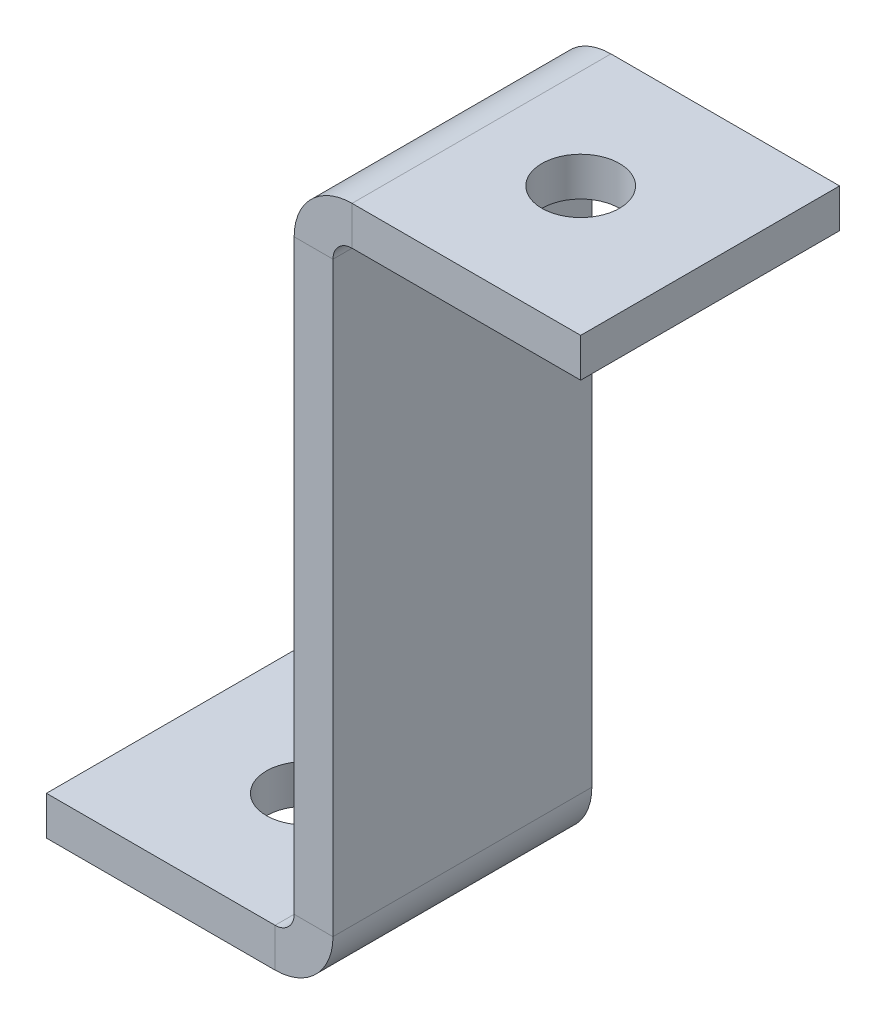
ISO-10303-21;
HEADER;
FILE_DESCRIPTION(('STEP AP214'),'2;1');
FILE_NAME('part.step','',(''),(''),'','','');
FILE_SCHEMA(('AUTOMOTIVE_DESIGN { 1 0 10303 214 1 1 1 1 }'));
ENDSEC;
DATA;
#1=APPLICATION_CONTEXT('core data for automotive mechanical design processes');
#2=APPLICATION_PROTOCOL_DEFINITION('international standard','automotive_design',2000,#1);
#3=PRODUCT_CONTEXT('',#1,'mechanical');
#4=PRODUCT('Part','Part','',(#3));
#5=PRODUCT_RELATED_PRODUCT_CATEGORY('part','',(#4));
#6=PRODUCT_DEFINITION_FORMATION('','',#4);
#7=PRODUCT_DEFINITION_CONTEXT('part definition',#1,'design');
#8=PRODUCT_DEFINITION('design','',#6,#7);
#9=PRODUCT_DEFINITION_SHAPE('','',#8);
#10=(LENGTH_UNIT() NAMED_UNIT(*) SI_UNIT(.MILLI.,.METRE.));
#11=(NAMED_UNIT(*) PLANE_ANGLE_UNIT() SI_UNIT($,.RADIAN.));
#12=(NAMED_UNIT(*) SI_UNIT($,.STERADIAN.) SOLID_ANGLE_UNIT());
#13=UNCERTAINTY_MEASURE_WITH_UNIT(LENGTH_MEASURE(1.E-05),#10,'distance_accuracy_value','');
#14=(GEOMETRIC_REPRESENTATION_CONTEXT(3) GLOBAL_UNCERTAINTY_ASSIGNED_CONTEXT((#13)) GLOBAL_UNIT_ASSIGNED_CONTEXT((#10,
#11,#12)) REPRESENTATION_CONTEXT('',''));
#15=CARTESIAN_POINT('',(0.,0.,0.));
#16=DIRECTION('',(0.,0.,1.));
#17=DIRECTION('',(1.,0.,0.));
#18=AXIS2_PLACEMENT_3D('',#15,#16,#17);
#19=CARTESIAN_POINT('',(11.0690270902934,-10.4309729097066,-10.));
#20=DIRECTION('',(0.,0.,-1.));
#21=DIRECTION('',(0.,-1.,0.));
#22=AXIS2_PLACEMENT_3D('',#19,#20,#21);
#23=PLANE('',#22);
#24=DIRECTION('',(0.,-1.,0.));
#25=VECTOR('',#24,1.);
#26=CARTESIAN_POINT('',(9.56902709029339,-10.4309729097066,-10.));
#27=LINE('',#26,#25);
#28=CARTESIAN_POINT('',(9.56902709029327,23.4014541805866,-10.));
#29=VERTEX_POINT('',#28);
#30=CARTESIAN_POINT('',(9.56902709029335,0.736600000000002,-10.));
#31=VERTEX_POINT('',#30);
#32=EDGE_CURVE('E71',#29,#31,#27,.T.);
#33=ORIENTED_EDGE('',*,*,#32,.F.);
#34=DIRECTION('',(1.,0.,0.));
#35=VECTOR('',#34,1.);
#36=CARTESIAN_POINT('',(11.0690270902933,23.4014541805867,-10.));
#37=LINE('',#36,#35);
#38=CARTESIAN_POINT('',(11.0690270902933,23.4014541805867,-10.));
#39=VERTEX_POINT('',#38);
#40=EDGE_CURVE('E242',#29,#39,#37,.T.);
#41=ORIENTED_EDGE('',*,*,#40,.T.);
#42=DIRECTION('',(0.,-1.,0.));
#43=VECTOR('',#42,1.);
#44=CARTESIAN_POINT('',(11.0690270902934,-10.4309729097066,-10.));
#45=LINE('',#44,#43);
#46=CARTESIAN_POINT('',(11.0690270902933,0.736600000000007,-10.));
#47=VERTEX_POINT('',#46);
#48=EDGE_CURVE('E50',#39,#47,#45,.T.);
#49=ORIENTED_EDGE('',*,*,#48,.T.);
#50=DIRECTION('',(1.,0.,0.));
#51=VECTOR('',#50,1.);
#52=CARTESIAN_POINT('',(11.0690270902933,0.736600000000011,-10.));
#53=LINE('',#52,#51);
#54=EDGE_CURVE('E236',#31,#47,#53,.T.);
#55=ORIENTED_EDGE('',*,*,#54,.F.);
#56=EDGE_LOOP('',(#33,#41,#49,#55));
#57=FACE_BOUND('',#56,.T.);
#58=ADVANCED_FACE('F46',(#57),#23,.T.);
#59=CARTESIAN_POINT('',(11.0690270902934,-10.4309729097066,0.));
#60=DIRECTION('',(0.,0.,1.));
#61=DIRECTION('',(0.,1.,0.));
#62=AXIS2_PLACEMENT_3D('',#59,#60,#61);
#63=PLANE('',#62);
#64=DIRECTION('',(0.,1.,0.));
#65=VECTOR('',#64,1.);
#66=CARTESIAN_POINT('',(11.0690270902934,-10.4309729097066,0.));
#67=LINE('',#66,#65);
#68=CARTESIAN_POINT('',(11.0690270902934,0.736600000000007,0.));
#69=VERTEX_POINT('',#68);
#70=CARTESIAN_POINT('',(11.0690270902933,23.4014541805867,0.));
#71=VERTEX_POINT('',#70);
#72=EDGE_CURVE('E246',#69,#71,#67,.T.);
#73=ORIENTED_EDGE('',*,*,#72,.T.);
#74=DIRECTION('',(-1.,0.,0.));
#75=VECTOR('',#74,1.);
#76=CARTESIAN_POINT('',(11.0690270902933,23.4014541805867,0.));
#77=LINE('',#76,#75);
#78=CARTESIAN_POINT('',(9.56902709029327,23.4014541805867,0.));
#79=VERTEX_POINT('',#78);
#80=EDGE_CURVE('E12',#71,#79,#77,.T.);
#81=ORIENTED_EDGE('',*,*,#80,.T.);
#82=DIRECTION('',(0.,1.,0.));
#83=VECTOR('',#82,1.);
#84=CARTESIAN_POINT('',(9.56902709029339,-10.4309729097066,0.));
#85=LINE('',#84,#83);
#86=CARTESIAN_POINT('',(9.56902709029335,0.736600000000002,0.));
#87=VERTEX_POINT('',#86);
#88=EDGE_CURVE('E198',#87,#79,#85,.T.);
#89=ORIENTED_EDGE('',*,*,#88,.F.);
#90=DIRECTION('',(-1.,0.,0.));
#91=VECTOR('',#90,1.);
#92=CARTESIAN_POINT('',(11.0690270902933,0.736600000000011,0.));
#93=LINE('',#92,#91);
#94=EDGE_CURVE('E231',#69,#87,#93,.T.);
#95=ORIENTED_EDGE('',*,*,#94,.F.);
#96=EDGE_LOOP('',(#73,#81,#89,#95));
#97=FACE_BOUND('',#96,.T.);
#98=ADVANCED_FACE('F48',(#97),#63,.T.);
#99=CARTESIAN_POINT('',(11.0690270902934,-10.4309729097066,0.));
#100=DIRECTION('',(1.,0.,0.));
#101=DIRECTION('',(0.,0.,-1.));
#102=AXIS2_PLACEMENT_3D('',#99,#100,#101);
#103=PLANE('',#102);
#104=ORIENTED_EDGE('',*,*,#48,.F.);
#105=DIRECTION('',(0.,0.,1.));
#106=VECTOR('',#105,1.);
#107=CARTESIAN_POINT('',(11.0690270902933,23.4014541805867,0.));
#108=LINE('',#107,#106);
#109=EDGE_CURVE('E239',#39,#71,#108,.T.);
#110=ORIENTED_EDGE('',*,*,#109,.T.);
#111=ORIENTED_EDGE('',*,*,#72,.F.);
#112=DIRECTION('',(0.,0.,1.));
#113=VECTOR('',#112,1.);
#114=CARTESIAN_POINT('',(11.0690270902933,0.736600000000011,0.));
#115=LINE('',#114,#113);
#116=EDGE_CURVE('E228',#47,#69,#115,.T.);
#117=ORIENTED_EDGE('',*,*,#116,.F.);
#118=EDGE_LOOP('',(#104,#110,#111,#117));
#119=FACE_BOUND('',#118,.T.);
#120=ADVANCED_FACE('F261',(#119),#103,.T.);
#121=CARTESIAN_POINT('',(9.56902709029339,-10.4309729097066,0.));
#122=DIRECTION('',(1.,0.,0.));
#123=DIRECTION('',(0.,0.,-1.));
#124=AXIS2_PLACEMENT_3D('',#121,#122,#123);
#125=PLANE('',#124);
#126=DIRECTION('',(0.,0.,1.));
#127=VECTOR('',#126,1.);
#128=CARTESIAN_POINT('',(9.56902709029327,23.4014541805867,0.));
#129=LINE('',#128,#127);
#130=EDGE_CURVE('E55',#29,#79,#129,.T.);
#131=ORIENTED_EDGE('',*,*,#130,.F.);
#132=ORIENTED_EDGE('',*,*,#32,.T.);
#133=DIRECTION('',(0.,0.,1.));
#134=VECTOR('',#133,1.);
#135=CARTESIAN_POINT('',(9.56902709029335,0.736600000000006,0.));
#136=LINE('',#135,#134);
#137=EDGE_CURVE('E234',#31,#87,#136,.T.);
#138=ORIENTED_EDGE('',*,*,#137,.T.);
#139=ORIENTED_EDGE('',*,*,#88,.T.);
#140=EDGE_LOOP('',(#131,#132,#138,#139));
#141=FACE_BOUND('',#140,.T.);
#142=ADVANCED_FACE('F250',(#141),#125,.F.);
#143=CARTESIAN_POINT('',(0.,-1.5,0.));
#144=DIRECTION('',(-1.,0.,0.));
#145=DIRECTION('',(0.,0.,1.));
#146=AXIS2_PLACEMENT_3D('',#143,#144,#145);
#147=PLANE('',#146);
#148=DIRECTION('',(0.,0.,1.));
#149=VECTOR('',#148,1.);
#150=CARTESIAN_POINT('',(0.,0.,0.));
#151=LINE('',#150,#149);
#152=CARTESIAN_POINT('',(0.,0.,-10.));
#153=VERTEX_POINT('',#152);
#154=CARTESIAN_POINT('',(0.,0.,0.));
#155=VERTEX_POINT('',#154);
#156=EDGE_CURVE('E207',#153,#155,#151,.T.);
#157=ORIENTED_EDGE('',*,*,#156,.F.);
#158=DIRECTION('',(0.,1.,0.));
#159=VECTOR('',#158,1.);
#160=CARTESIAN_POINT('',(0.,-1.5,-10.));
#161=LINE('',#160,#159);
#162=CARTESIAN_POINT('',(0.,-1.5,-10.));
#163=VERTEX_POINT('',#162);
#164=EDGE_CURVE('E195',#163,#153,#161,.T.);
#165=ORIENTED_EDGE('',*,*,#164,.F.);
#166=DIRECTION('',(0.,0.,1.));
#167=VECTOR('',#166,1.);
#168=CARTESIAN_POINT('',(0.,-1.5,0.));
#169=LINE('',#168,#167);
#170=CARTESIAN_POINT('',(0.,-1.5,0.));
#171=VERTEX_POINT('',#170);
#172=EDGE_CURVE('E223',#163,#171,#169,.T.);
#173=ORIENTED_EDGE('',*,*,#172,.T.);
#174=DIRECTION('',(0.,1.,0.));
#175=VECTOR('',#174,1.);
#176=CARTESIAN_POINT('',(0.,-1.5,0.));
#177=LINE('',#176,#175);
#178=EDGE_CURVE('E221',#171,#155,#177,.T.);
#179=ORIENTED_EDGE('',*,*,#178,.T.);
#180=EDGE_LOOP('',(#157,#165,#173,#179));
#181=FACE_BOUND('',#180,.T.);
#182=ADVANCED_FACE('F323',(#181),#147,.T.);
#183=CARTESIAN_POINT('',(0.,-1.5,0.));
#184=DIRECTION('',(0.,-1.,0.));
#185=DIRECTION('',(0.,0.,-1.));
#186=AXIS2_PLACEMENT_3D('',#183,#184,#185);
#187=PLANE('',#186);
#188=CARTESIAN_POINT('',(5.,-1.5,-5.));
#189=DIRECTION('',(0.,1.,0.));
#190=DIRECTION('',(0.,0.,1.));
#191=AXIS2_PLACEMENT_3D('',#188,#189,#190);
#192=CIRCLE('',#191,1.5);
#193=CARTESIAN_POINT('',(5.,-1.5,-3.5));
#194=VERTEX_POINT('',#193);
#195=EDGE_CURVE('E173',#194,#194,#192,.T.);
#196=ORIENTED_EDGE('',*,*,#195,.T.);
#197=EDGE_LOOP('',(#196));
#198=FACE_BOUND('',#197,.T.);
#199=DIRECTION('',(-1.,0.,0.));
#200=VECTOR('',#199,1.);
#201=CARTESIAN_POINT('',(0.,-1.5,-10.));
#202=LINE('',#201,#200);
#203=CARTESIAN_POINT('',(8.83242709029335,-1.5,-10.));
#204=VERTEX_POINT('',#203);
#205=EDGE_CURVE('E199',#204,#163,#202,.T.);
#206=ORIENTED_EDGE('',*,*,#205,.F.);
#207=DIRECTION('',(0.,0.,1.));
#208=VECTOR('',#207,1.);
#209=CARTESIAN_POINT('',(8.83242709029335,-1.5,0.));
#210=LINE('',#209,#208);
#211=CARTESIAN_POINT('',(8.83242709029335,-1.5,0.));
#212=VERTEX_POINT('',#211);
#213=EDGE_CURVE('E218',#204,#212,#210,.T.);
#214=ORIENTED_EDGE('',*,*,#213,.T.);
#215=DIRECTION('',(1.,0.,0.));
#216=VECTOR('',#215,1.);
#217=CARTESIAN_POINT('',(0.,-1.5,0.));
#218=LINE('',#217,#216);
#219=EDGE_CURVE('E215',#171,#212,#218,.T.);
#220=ORIENTED_EDGE('',*,*,#219,.F.);
#221=ORIENTED_EDGE('',*,*,#172,.F.);
#222=EDGE_LOOP('',(#206,#214,#220,#221));
#223=FACE_BOUND('',#222,.T.);
#224=ADVANCED_FACE('F328',(#198,#223),#187,.T.);
#225=CARTESIAN_POINT('',(0.,-1.5,0.));
#226=DIRECTION('',(0.,0.,1.));
#227=DIRECTION('',(1.,0.,0.));
#228=AXIS2_PLACEMENT_3D('',#225,#226,#227);
#229=PLANE('',#228);
#230=ORIENTED_EDGE('',*,*,#219,.T.);
#231=DIRECTION('',(0.,1.,0.));
#232=VECTOR('',#231,1.);
#233=CARTESIAN_POINT('',(8.83242709029335,-1.5,0.));
#234=LINE('',#233,#232);
#235=CARTESIAN_POINT('',(8.83242709029335,0.,0.));
#236=VERTEX_POINT('',#235);
#237=EDGE_CURVE('E212',#212,#236,#234,.T.);
#238=ORIENTED_EDGE('',*,*,#237,.T.);
#239=DIRECTION('',(1.,0.,0.));
#240=VECTOR('',#239,1.);
#241=CARTESIAN_POINT('',(0.,0.,0.));
#242=LINE('',#241,#240);
#243=EDGE_CURVE('E204',#155,#236,#242,.T.);
#244=ORIENTED_EDGE('',*,*,#243,.F.);
#245=ORIENTED_EDGE('',*,*,#178,.F.);
#246=EDGE_LOOP('',(#230,#238,#244,#245));
#247=FACE_BOUND('',#246,.T.);
#248=ADVANCED_FACE('F407',(#247),#229,.T.);
#249=CARTESIAN_POINT('',(0.,0.,0.));
#250=DIRECTION('',(0.,-1.,0.));
#251=DIRECTION('',(0.,0.,-1.));
#252=AXIS2_PLACEMENT_3D('',#249,#250,#251);
#253=PLANE('',#252);
#254=CARTESIAN_POINT('',(5.,0.,-5.));
#255=DIRECTION('',(0.,1.,0.));
#256=DIRECTION('',(0.,0.,1.));
#257=AXIS2_PLACEMENT_3D('',#254,#255,#256);
#258=CIRCLE('',#257,1.5);
#259=CARTESIAN_POINT('',(5.,0.,-3.5));
#260=VERTEX_POINT('',#259);
#261=EDGE_CURVE('E285',#260,#260,#258,.T.);
#262=ORIENTED_EDGE('',*,*,#261,.F.);
#263=EDGE_LOOP('',(#262));
#264=FACE_BOUND('',#263,.T.);
#265=DIRECTION('',(0.,0.,1.));
#266=VECTOR('',#265,1.);
#267=CARTESIAN_POINT('',(8.83242709029335,0.,0.));
#268=LINE('',#267,#266);
#269=CARTESIAN_POINT('',(8.83242709029335,0.,-10.));
#270=VERTEX_POINT('',#269);
#271=EDGE_CURVE('E191',#270,#236,#268,.T.);
#272=ORIENTED_EDGE('',*,*,#271,.F.);
#273=DIRECTION('',(-1.,0.,0.));
#274=VECTOR('',#273,1.);
#275=CARTESIAN_POINT('',(0.,0.,-10.));
#276=LINE('',#275,#274);
#277=EDGE_CURVE('E210',#270,#153,#276,.T.);
#278=ORIENTED_EDGE('',*,*,#277,.T.);
#279=ORIENTED_EDGE('',*,*,#156,.T.);
#280=ORIENTED_EDGE('',*,*,#243,.T.);
#281=EDGE_LOOP('',(#272,#278,#279,#280));
#282=FACE_BOUND('',#281,.T.);
#283=ADVANCED_FACE('F399',(#264,#282),#253,.F.);
#284=CARTESIAN_POINT('',(0.,-1.5,-10.));
#285=DIRECTION('',(0.,0.,-1.));
#286=DIRECTION('',(-1.,0.,0.));
#287=AXIS2_PLACEMENT_3D('',#284,#285,#286);
#288=PLANE('',#287);
#289=ORIENTED_EDGE('',*,*,#277,.F.);
#290=DIRECTION('',(0.,-1.,0.));
#291=VECTOR('',#290,1.);
#292=CARTESIAN_POINT('',(8.83242709029335,-1.5,-10.));
#293=LINE('',#292,#291);
#294=EDGE_CURVE('E201',#270,#204,#293,.T.);
#295=ORIENTED_EDGE('',*,*,#294,.T.);
#296=ORIENTED_EDGE('',*,*,#205,.T.);
#297=ORIENTED_EDGE('',*,*,#164,.T.);
#298=EDGE_LOOP('',(#289,#295,#296,#297));
#299=FACE_BOUND('',#298,.T.);
#300=ADVANCED_FACE('F388',(#299),#288,.T.);
#301=CARTESIAN_POINT('',(8.83242709029335,0.7366,-10.));
#302=DIRECTION('',(0.,0.,-1.));
#303=DIRECTION('',(-1.,0.,0.));
#304=AXIS2_PLACEMENT_3D('',#301,#302,#303);
#305=PLANE('',#304);
#306=ORIENTED_EDGE('',*,*,#294,.F.);
#307=CARTESIAN_POINT('',(8.83242709029335,0.7366,-10.));
#308=DIRECTION('',(0.,0.,1.));
#309=DIRECTION('',(1.,0.,0.));
#310=AXIS2_PLACEMENT_3D('',#307,#308,#309);
#311=CIRCLE('',#310,0.7366);
#312=EDGE_CURVE('E180',#270,#31,#311,.T.);
#313=ORIENTED_EDGE('',*,*,#312,.T.);
#314=ORIENTED_EDGE('',*,*,#54,.T.);
#315=CARTESIAN_POINT('',(8.83242709029335,0.7366,-10.));
#316=DIRECTION('',(0.,0.,1.));
#317=DIRECTION('',(-1.,0.,0.));
#318=AXIS2_PLACEMENT_3D('',#315,#316,#317);
#319=CIRCLE('',#318,2.2366);
#320=EDGE_CURVE('E184',#204,#47,#319,.T.);
#321=ORIENTED_EDGE('',*,*,#320,.F.);
#322=EDGE_LOOP('',(#306,#313,#314,#321));
#323=FACE_BOUND('',#322,.T.);
#324=ADVANCED_FACE('F377',(#323),#305,.T.);
#325=CARTESIAN_POINT('',(8.83242709029335,0.7366,0.));
#326=DIRECTION('',(0.,0.,1.));
#327=DIRECTION('',(1.,0.,0.));
#328=AXIS2_PLACEMENT_3D('',#325,#326,#327);
#329=PLANE('',#328);
#330=CARTESIAN_POINT('',(8.83242709029335,0.7366,0.));
#331=DIRECTION('',(0.,0.,1.));
#332=DIRECTION('',(1.,0.,0.));
#333=AXIS2_PLACEMENT_3D('',#330,#331,#332);
#334=CIRCLE('',#333,0.7366);
#335=EDGE_CURVE('E188',#87,#236,#334,.F.);
#336=ORIENTED_EDGE('',*,*,#335,.T.);
#337=ORIENTED_EDGE('',*,*,#237,.F.);
#338=CARTESIAN_POINT('',(8.83242709029335,0.7366,0.));
#339=DIRECTION('',(0.,0.,-1.));
#340=DIRECTION('',(1.,0.,0.));
#341=AXIS2_PLACEMENT_3D('',#338,#339,#340);
#342=CIRCLE('',#341,2.2366);
#343=EDGE_CURVE('E187',#69,#212,#342,.T.);
#344=ORIENTED_EDGE('',*,*,#343,.F.);
#345=ORIENTED_EDGE('',*,*,#94,.T.);
#346=EDGE_LOOP('',(#336,#337,#344,#345));
#347=FACE_BOUND('',#346,.T.);
#348=ADVANCED_FACE('F366',(#347),#329,.T.);
#349=CARTESIAN_POINT('',(8.83242709029335,0.7366,-15.3780010598344));
#350=DIRECTION('',(0.,0.,1.));
#351=DIRECTION('',(1.,0.,0.));
#352=AXIS2_PLACEMENT_3D('',#349,#350,#351);
#353=CYLINDRICAL_SURFACE('',#352,2.2366);
#354=ORIENTED_EDGE('',*,*,#116,.T.);
#355=ORIENTED_EDGE('',*,*,#343,.T.);
#356=ORIENTED_EDGE('',*,*,#213,.F.);
#357=ORIENTED_EDGE('',*,*,#320,.T.);
#358=EDGE_LOOP('',(#354,#355,#356,#357));
#359=FACE_BOUND('',#358,.T.);
#360=ADVANCED_FACE('F354',(#359),#353,.T.);
#361=CARTESIAN_POINT('',(8.83242709029335,0.7366,-15.3780010598344));
#362=DIRECTION('',(0.,0.,1.));
#363=DIRECTION('',(1.,0.,0.));
#364=AXIS2_PLACEMENT_3D('',#361,#362,#363);
#365=CYLINDRICAL_SURFACE('',#364,0.7366);
#366=ORIENTED_EDGE('',*,*,#137,.F.);
#367=ORIENTED_EDGE('',*,*,#312,.F.);
#368=ORIENTED_EDGE('',*,*,#271,.T.);
#369=ORIENTED_EDGE('',*,*,#335,.F.);
#370=EDGE_LOOP('',(#366,#367,#368,#369));
#371=FACE_BOUND('',#370,.T.);
#372=ADVANCED_FACE('F349',(#371),#365,.F.);
#373=CARTESIAN_POINT('',(11.8056270902933,23.4014541805867,-10.));
#374=DIRECTION('',(0.,0.,1.));
#375=DIRECTION('',(1.,0.,0.));
#376=AXIS2_PLACEMENT_3D('',#373,#374,#375);
#377=PLANE('',#376);
#378=ORIENTED_EDGE('',*,*,#40,.F.);
#379=CARTESIAN_POINT('',(11.8056270902933,23.4014541805867,-10.));
#380=DIRECTION('',(0.,0.,1.));
#381=DIRECTION('',(1.,0.,0.));
#382=AXIS2_PLACEMENT_3D('',#379,#380,#381);
#383=CIRCLE('',#382,2.2366);
#384=CARTESIAN_POINT('',(11.8056270902933,25.6380541805867,-10.));
#385=VERTEX_POINT('',#384);
#386=EDGE_CURVE('E157',#29,#385,#383,.F.);
#387=ORIENTED_EDGE('',*,*,#386,.T.);
#388=DIRECTION('',(0.,-1.,0.));
#389=VECTOR('',#388,1.);
#390=CARTESIAN_POINT('',(11.8056270902933,24.1380541805867,-10.));
#391=LINE('',#390,#389);
#392=CARTESIAN_POINT('',(11.8056270902933,24.1380541805867,-10.));
#393=VERTEX_POINT('',#392);
#394=EDGE_CURVE('E163',#385,#393,#391,.T.);
#395=ORIENTED_EDGE('',*,*,#394,.T.);
#396=CARTESIAN_POINT('',(11.8056270902933,23.4014541805867,-10.));
#397=DIRECTION('',(0.,0.,-1.));
#398=DIRECTION('',(1.,0.,0.));
#399=AXIS2_PLACEMENT_3D('',#396,#397,#398);
#400=CIRCLE('',#399,0.7366);
#401=EDGE_CURVE('E174',#39,#393,#400,.T.);
#402=ORIENTED_EDGE('',*,*,#401,.F.);
#403=EDGE_LOOP('',(#378,#387,#395,#402));
#404=FACE_BOUND('',#403,.T.);
#405=ADVANCED_FACE('F266',(#404),#377,.F.);
#406=CARTESIAN_POINT('',(11.8056270902933,23.4014541805867,0.));
#407=DIRECTION('',(0.,0.,-1.));
#408=DIRECTION('',(-1.,0.,0.));
#409=AXIS2_PLACEMENT_3D('',#406,#407,#408);
#410=PLANE('',#409);
#411=CARTESIAN_POINT('',(11.8056270902933,23.4014541805867,0.));
#412=DIRECTION('',(0.,0.,1.));
#413=DIRECTION('',(1.,0.,0.));
#414=AXIS2_PLACEMENT_3D('',#411,#412,#413);
#415=CIRCLE('',#414,2.2366);
#416=CARTESIAN_POINT('',(11.8056270902933,25.6380541805867,0.));
#417=VERTEX_POINT('',#416);
#418=EDGE_CURVE('E63',#417,#79,#415,.T.);
#419=ORIENTED_EDGE('',*,*,#418,.T.);
#420=ORIENTED_EDGE('',*,*,#80,.F.);
#421=CARTESIAN_POINT('',(11.8056270902933,23.4014541805867,0.));
#422=DIRECTION('',(0.,0.,1.));
#423=DIRECTION('',(-1.,0.,0.));
#424=AXIS2_PLACEMENT_3D('',#421,#422,#423);
#425=CIRCLE('',#424,0.7366);
#426=CARTESIAN_POINT('',(11.8056270902933,24.1380541805867,0.));
#427=VERTEX_POINT('',#426);
#428=EDGE_CURVE('E177',#427,#71,#425,.T.);
#429=ORIENTED_EDGE('',*,*,#428,.F.);
#430=DIRECTION('',(0.,1.,0.));
#431=VECTOR('',#430,1.);
#432=CARTESIAN_POINT('',(11.8056270902933,24.1380541805867,0.));
#433=LINE('',#432,#431);
#434=EDGE_CURVE('E145',#427,#417,#433,.T.);
#435=ORIENTED_EDGE('',*,*,#434,.T.);
#436=EDGE_LOOP('',(#419,#420,#429,#435));
#437=FACE_BOUND('',#436,.T.);
#438=ADVANCED_FACE('F255',(#437),#410,.F.);
#439=CARTESIAN_POINT('',(11.8056270902933,23.4014541805867,-15.3780010598344));
#440=DIRECTION('',(0.,0.,1.));
#441=DIRECTION('',(1.,0.,0.));
#442=AXIS2_PLACEMENT_3D('',#439,#440,#441);
#443=CYLINDRICAL_SURFACE('',#442,0.7366);
#444=DIRECTION('',(0.,0.,1.));
#445=VECTOR('',#444,1.);
#446=CARTESIAN_POINT('',(11.8056270902933,24.1380541805867,0.));
#447=LINE('',#446,#445);
#448=EDGE_CURVE('E171',#393,#427,#447,.T.);
#449=ORIENTED_EDGE('',*,*,#448,.T.);
#450=ORIENTED_EDGE('',*,*,#428,.T.);
#451=ORIENTED_EDGE('',*,*,#109,.F.);
#452=ORIENTED_EDGE('',*,*,#401,.T.);
#453=EDGE_LOOP('',(#449,#450,#451,#452));
#454=FACE_BOUND('',#453,.T.);
#455=ADVANCED_FACE('F257',(#454),#443,.F.);
#456=CARTESIAN_POINT('',(11.8056270902933,23.4014541805867,-15.3780010598344));
#457=DIRECTION('',(0.,0.,1.));
#458=DIRECTION('',(1.,0.,0.));
#459=AXIS2_PLACEMENT_3D('',#456,#457,#458);
#460=CYLINDRICAL_SURFACE('',#459,2.2366);
#461=DIRECTION('',(0.,0.,1.));
#462=VECTOR('',#461,1.);
#463=CARTESIAN_POINT('',(11.8056270902933,25.6380541805867,0.));
#464=LINE('',#463,#462);
#465=EDGE_CURVE('E271',#385,#417,#464,.T.);
#466=ORIENTED_EDGE('',*,*,#465,.F.);
#467=ORIENTED_EDGE('',*,*,#386,.F.);
#468=ORIENTED_EDGE('',*,*,#130,.T.);
#469=ORIENTED_EDGE('',*,*,#418,.F.);
#470=EDGE_LOOP('',(#466,#467,#468,#469));
#471=FACE_BOUND('',#470,.T.);
#472=ADVANCED_FACE('F269',(#471),#460,.T.);
#473=CARTESIAN_POINT('',(20.6380541805866,24.1380541805867,0.));
#474=DIRECTION('',(1.,0.,0.));
#475=DIRECTION('',(0.,0.,-1.));
#476=AXIS2_PLACEMENT_3D('',#473,#474,#475);
#477=PLANE('',#476);
#478=DIRECTION('',(0.,0.,-1.));
#479=VECTOR('',#478,1.);
#480=CARTESIAN_POINT('',(20.6380541805866,25.6380541805867,0.));
#481=LINE('',#480,#479);
#482=CARTESIAN_POINT('',(20.6380541805866,25.6380541805867,0.));
#483=VERTEX_POINT('',#482);
#484=CARTESIAN_POINT('',(20.6380541805866,25.6380541805867,-10.));
#485=VERTEX_POINT('',#484);
#486=EDGE_CURVE('E149',#483,#485,#481,.T.);
#487=ORIENTED_EDGE('',*,*,#486,.F.);
#488=DIRECTION('',(0.,1.,0.));
#489=VECTOR('',#488,1.);
#490=CARTESIAN_POINT('',(20.6380541805866,24.1380541805867,0.));
#491=LINE('',#490,#489);
#492=CARTESIAN_POINT('',(20.6380541805866,24.1380541805867,0.));
#493=VERTEX_POINT('',#492);
#494=EDGE_CURVE('E143',#493,#483,#491,.T.);
#495=ORIENTED_EDGE('',*,*,#494,.F.);
#496=DIRECTION('',(0.,0.,-1.));
#497=VECTOR('',#496,1.);
#498=CARTESIAN_POINT('',(20.6380541805866,24.1380541805867,0.));
#499=LINE('',#498,#497);
#500=CARTESIAN_POINT('',(20.6380541805866,24.1380541805867,-10.));
#501=VERTEX_POINT('',#500);
#502=EDGE_CURVE('E154',#493,#501,#499,.T.);
#503=ORIENTED_EDGE('',*,*,#502,.T.);
#504=DIRECTION('',(0.,1.,0.));
#505=VECTOR('',#504,1.);
#506=CARTESIAN_POINT('',(20.6380541805866,24.1380541805867,-10.));
#507=LINE('',#506,#505);
#508=EDGE_CURVE('E162',#501,#485,#507,.T.);
#509=ORIENTED_EDGE('',*,*,#508,.T.);
#510=EDGE_LOOP('',(#487,#495,#503,#509));
#511=FACE_BOUND('',#510,.T.);
#512=ADVANCED_FACE('F153',(#511),#477,.T.);
#513=CARTESIAN_POINT('',(-24.3619458194134,24.1380541805867,0.));
#514=DIRECTION('',(0.,-1.,0.));
#515=DIRECTION('',(0.,0.,-1.));
#516=AXIS2_PLACEMENT_3D('',#513,#514,#515);
#517=PLANE('',#516);
#518=CARTESIAN_POINT('',(15.6380541805866,24.1380541805867,-5.));
#519=DIRECTION('',(0.,1.,0.));
#520=DIRECTION('',(0.,0.,1.));
#521=AXIS2_PLACEMENT_3D('',#518,#519,#520);
#522=CIRCLE('',#521,1.5);
#523=CARTESIAN_POINT('',(15.6380541805866,24.1380541805867,-3.5));
#524=VERTEX_POINT('',#523);
#525=EDGE_CURVE('E288',#524,#524,#522,.T.);
#526=ORIENTED_EDGE('',*,*,#525,.T.);
#527=EDGE_LOOP('',(#526));
#528=FACE_BOUND('',#527,.T.);
#529=ORIENTED_EDGE('',*,*,#448,.F.);
#530=DIRECTION('',(-1.,0.,0.));
#531=VECTOR('',#530,1.);
#532=CARTESIAN_POINT('',(-24.3619458194134,24.1380541805867,-10.));
#533=LINE('',#532,#531);
#534=EDGE_CURVE('E161',#501,#393,#533,.T.);
#535=ORIENTED_EDGE('',*,*,#534,.F.);
#536=ORIENTED_EDGE('',*,*,#502,.F.);
#537=DIRECTION('',(1.,0.,0.));
#538=VECTOR('',#537,1.);
#539=CARTESIAN_POINT('',(-24.3619458194134,24.1380541805867,0.));
#540=LINE('',#539,#538);
#541=EDGE_CURVE('E140',#427,#493,#540,.T.);
#542=ORIENTED_EDGE('',*,*,#541,.F.);
#543=EDGE_LOOP('',(#529,#535,#536,#542));
#544=FACE_BOUND('',#543,.T.);
#545=ADVANCED_FACE('F159',(#528,#544),#517,.T.);
#546=CARTESIAN_POINT('',(-24.3619458194134,24.1380541805867,-10.));
#547=DIRECTION('',(0.,0.,-1.));
#548=DIRECTION('',(-1.,0.,0.));
#549=AXIS2_PLACEMENT_3D('',#546,#547,#548);
#550=PLANE('',#549);
#551=ORIENTED_EDGE('',*,*,#394,.F.);
#552=DIRECTION('',(-1.,0.,0.));
#553=VECTOR('',#552,1.);
#554=CARTESIAN_POINT('',(-24.3619458194134,25.6380541805867,-10.));
#555=LINE('',#554,#553);
#556=EDGE_CURVE('E274',#485,#385,#555,.T.);
#557=ORIENTED_EDGE('',*,*,#556,.F.);
#558=ORIENTED_EDGE('',*,*,#508,.F.);
#559=ORIENTED_EDGE('',*,*,#534,.T.);
#560=EDGE_LOOP('',(#551,#557,#558,#559));
#561=FACE_BOUND('',#560,.T.);
#562=ADVANCED_FACE('F281',(#561),#550,.T.);
#563=CARTESIAN_POINT('',(-24.3619458194134,25.6380541805867,0.));
#564=DIRECTION('',(0.,-1.,0.));
#565=DIRECTION('',(0.,0.,-1.));
#566=AXIS2_PLACEMENT_3D('',#563,#564,#565);
#567=PLANE('',#566);
#568=CARTESIAN_POINT('',(15.6380541805866,25.6380541805867,-5.));
#569=DIRECTION('',(0.,1.,0.));
#570=DIRECTION('',(0.,0.,1.));
#571=AXIS2_PLACEMENT_3D('',#568,#569,#570);
#572=CIRCLE('',#571,1.5);
#573=CARTESIAN_POINT('',(15.6380541805866,25.6380541805867,-3.5));
#574=VERTEX_POINT('',#573);
#575=EDGE_CURVE('E291',#574,#574,#572,.T.);
#576=ORIENTED_EDGE('',*,*,#575,.F.);
#577=EDGE_LOOP('',(#576));
#578=FACE_BOUND('',#577,.T.);
#579=ORIENTED_EDGE('',*,*,#556,.T.);
#580=ORIENTED_EDGE('',*,*,#465,.T.);
#581=DIRECTION('',(1.,0.,0.));
#582=VECTOR('',#581,1.);
#583=CARTESIAN_POINT('',(-24.3619458194134,25.6380541805867,0.));
#584=LINE('',#583,#582);
#585=EDGE_CURVE('E273',#417,#483,#584,.T.);
#586=ORIENTED_EDGE('',*,*,#585,.T.);
#587=ORIENTED_EDGE('',*,*,#486,.T.);
#588=EDGE_LOOP('',(#579,#580,#586,#587));
#589=FACE_BOUND('',#588,.T.);
#590=ADVANCED_FACE('F283',(#578,#589),#567,.F.);
#591=CARTESIAN_POINT('',(-24.3619458194134,24.1380541805867,0.));
#592=DIRECTION('',(0.,0.,1.));
#593=DIRECTION('',(1.,0.,0.));
#594=AXIS2_PLACEMENT_3D('',#591,#592,#593);
#595=PLANE('',#594);
#596=ORIENTED_EDGE('',*,*,#434,.F.);
#597=ORIENTED_EDGE('',*,*,#541,.T.);
#598=ORIENTED_EDGE('',*,*,#494,.T.);
#599=ORIENTED_EDGE('',*,*,#585,.F.);
#600=EDGE_LOOP('',(#596,#597,#598,#599));
#601=FACE_BOUND('',#600,.T.);
#602=ADVANCED_FACE('F142',(#601),#595,.T.);
#603=CARTESIAN_POINT('',(5.,-1.5,-5.));
#604=DIRECTION('',(0.,1.,0.));
#605=DIRECTION('',(0.,0.,1.));
#606=AXIS2_PLACEMENT_3D('',#603,#604,#605);
#607=CYLINDRICAL_SURFACE('',#606,1.5);
#608=ORIENTED_EDGE('',*,*,#195,.F.);
#609=EDGE_LOOP('',(#608));
#610=FACE_BOUND('',#609,.T.);
#611=ORIENTED_EDGE('',*,*,#261,.T.);
#612=EDGE_LOOP('',(#611));
#613=FACE_BOUND('',#612,.T.);
#614=ADVANCED_FACE('F301',(#610,#613),#607,.F.);
#615=CARTESIAN_POINT('',(15.6380541805866,24.1380541805867,-5.));
#616=DIRECTION('',(0.,1.,0.));
#617=DIRECTION('',(0.,0.,1.));
#618=AXIS2_PLACEMENT_3D('',#615,#616,#617);
#619=CYLINDRICAL_SURFACE('',#618,1.5);
#620=ORIENTED_EDGE('',*,*,#525,.F.);
#621=EDGE_LOOP('',(#620));
#622=FACE_BOUND('',#621,.T.);
#623=ORIENTED_EDGE('',*,*,#575,.T.);
#624=EDGE_LOOP('',(#623));
#625=FACE_BOUND('',#624,.T.);
#626=ADVANCED_FACE('F298',(#622,#625),#619,.F.);
#627=CLOSED_SHELL('',(#58,#98,#120,#142,#182,#224,#248,#283,#300,#324,#348,#360,#372,#405,#438,
#455,#472,#512,#545,#562,#590,#602,#614,#626));
#628=MANIFOLD_SOLID_BREP('B2',#627);
#629=ADVANCED_BREP_SHAPE_REPRESENTATION('',(#18,#628),#14);
#630=SHAPE_DEFINITION_REPRESENTATION(#9,#629);
ENDSEC;
END-ISO-10303-21;
